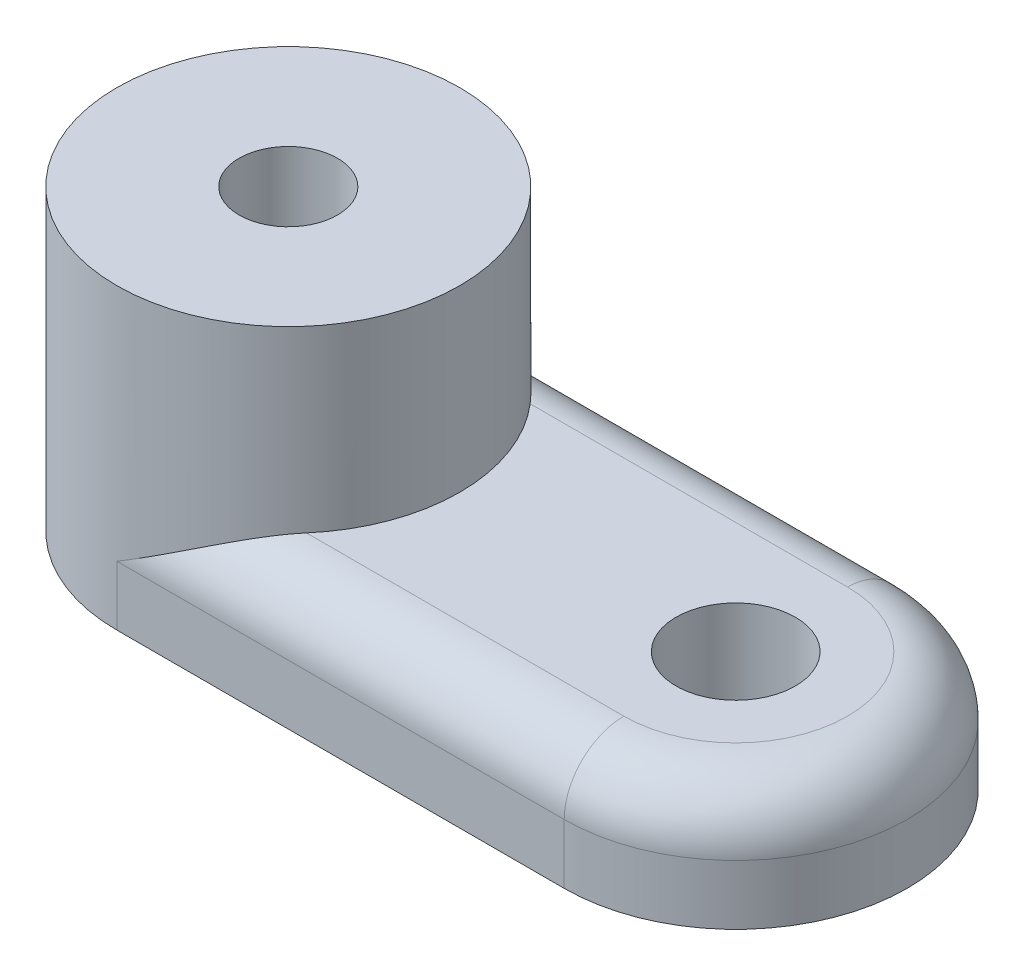
ISO-10303-21;
HEADER;
FILE_DESCRIPTION(('STEP AP214'),'2;1');
FILE_NAME('part.step','',(''),(''),'','','');
FILE_SCHEMA(('AUTOMOTIVE_DESIGN { 1 0 10303 214 1 1 1 1 }'));
ENDSEC;
DATA;
#1=APPLICATION_CONTEXT('core data for automotive mechanical design processes');
#2=APPLICATION_PROTOCOL_DEFINITION('international standard','automotive_design',2000,#1);
#3=PRODUCT_CONTEXT('',#1,'mechanical');
#4=PRODUCT('Part','Part','',(#3));
#5=PRODUCT_RELATED_PRODUCT_CATEGORY('part','',(#4));
#6=PRODUCT_DEFINITION_FORMATION('','',#4);
#7=PRODUCT_DEFINITION_CONTEXT('part definition',#1,'design');
#8=PRODUCT_DEFINITION('design','',#6,#7);
#9=PRODUCT_DEFINITION_SHAPE('','',#8);
#10=(LENGTH_UNIT() NAMED_UNIT(*) SI_UNIT(.MILLI.,.METRE.));
#11=(NAMED_UNIT(*) PLANE_ANGLE_UNIT() SI_UNIT($,.RADIAN.));
#12=(NAMED_UNIT(*) SI_UNIT($,.STERADIAN.) SOLID_ANGLE_UNIT());
#13=UNCERTAINTY_MEASURE_WITH_UNIT(LENGTH_MEASURE(1.E-05),#10,'distance_accuracy_value','');
#14=(GEOMETRIC_REPRESENTATION_CONTEXT(3) GLOBAL_UNCERTAINTY_ASSIGNED_CONTEXT((#13)) GLOBAL_UNIT_ASSIGNED_CONTEXT((#10,
#11,#12)) REPRESENTATION_CONTEXT('',''));
#15=CARTESIAN_POINT('',(0.,0.,0.));
#16=DIRECTION('',(0.,0.,1.));
#17=DIRECTION('',(1.,0.,0.));
#18=AXIS2_PLACEMENT_3D('',#15,#16,#17);
#19=CARTESIAN_POINT('',(0.,10.,0.));
#20=DIRECTION('',(0.,1.,0.));
#21=DIRECTION('',(0.,0.,1.));
#22=AXIS2_PLACEMENT_3D('',#19,#20,#21);
#23=PLANE('',#22);
#24=CARTESIAN_POINT('',(0.,10.,0.));
#25=DIRECTION('',(0.,1.,0.));
#26=DIRECTION('',(0.,0.,1.));
#27=AXIS2_PLACEMENT_3D('',#24,#25,#26);
#28=CIRCLE('',#27,5.75);
#29=CARTESIAN_POINT('',(0.,10.,5.75));
#30=VERTEX_POINT('',#29);
#31=EDGE_CURVE('E153',#30,#30,#28,.T.);
#32=ORIENTED_EDGE('',*,*,#31,.T.);
#33=EDGE_LOOP('',(#32));
#34=FACE_BOUND('',#33,.T.);
#35=CARTESIAN_POINT('',(0.,10.,0.));
#36=DIRECTION('',(0.,1.,0.));
#37=DIRECTION('',(0.,0.,1.));
#38=AXIS2_PLACEMENT_3D('',#35,#36,#37);
#39=CIRCLE('',#38,1.65);
#40=CARTESIAN_POINT('',(0.,10.,1.65));
#41=VERTEX_POINT('',#40);
#42=EDGE_CURVE('E146',#41,#41,#39,.T.);
#43=ORIENTED_EDGE('',*,*,#42,.F.);
#44=EDGE_LOOP('',(#43));
#45=FACE_BOUND('',#44,.T.);
#46=ADVANCED_FACE('F39',(#34,#45),#23,.T.);
#47=CARTESIAN_POINT('',(0.,0.,0.));
#48=DIRECTION('',(0.,1.,0.));
#49=DIRECTION('',(0.,0.,1.));
#50=AXIS2_PLACEMENT_3D('',#47,#48,#49);
#51=PLANE('',#50);
#52=CARTESIAN_POINT('',(0.,0.,0.));
#53=DIRECTION('',(0.,1.,0.));
#54=DIRECTION('',(0.,0.,1.));
#55=AXIS2_PLACEMENT_3D('',#52,#53,#54);
#56=CIRCLE('',#55,5.75);
#57=CARTESIAN_POINT('',(0.,0.,-5.75));
#58=VERTEX_POINT('',#57);
#59=CARTESIAN_POINT('',(0.,0.,5.75));
#60=VERTEX_POINT('',#59);
#61=EDGE_CURVE('E121',#58,#60,#56,.T.);
#62=ORIENTED_EDGE('',*,*,#61,.F.);
#63=DIRECTION('',(1.,0.,0.));
#64=VECTOR('',#63,1.);
#65=CARTESIAN_POINT('',(0.,0.,-5.75));
#66=LINE('',#65,#64);
#67=CARTESIAN_POINT('',(15.,0.,-5.75));
#68=VERTEX_POINT('',#67);
#69=EDGE_CURVE('E101',#58,#68,#66,.T.);
#70=ORIENTED_EDGE('',*,*,#69,.T.);
#71=CARTESIAN_POINT('',(15.,0.,0.));
#72=DIRECTION('',(0.,-1.,0.));
#73=DIRECTION('',(0.,0.,-1.));
#74=AXIS2_PLACEMENT_3D('',#71,#72,#73);
#75=CIRCLE('',#74,5.75);
#76=CARTESIAN_POINT('',(15.,0.,5.75));
#77=VERTEX_POINT('',#76);
#78=EDGE_CURVE('E109',#68,#77,#75,.T.);
#79=ORIENTED_EDGE('',*,*,#78,.T.);
#80=DIRECTION('',(-1.,0.,0.));
#81=VECTOR('',#80,1.);
#82=CARTESIAN_POINT('',(0.,0.,5.75));
#83=LINE('',#82,#81);
#84=EDGE_CURVE('E115',#77,#60,#83,.T.);
#85=ORIENTED_EDGE('',*,*,#84,.T.);
#86=EDGE_LOOP('',(#62,#70,#79,#85));
#87=FACE_BOUND('',#86,.T.);
#88=CARTESIAN_POINT('',(0.,0.,0.));
#89=DIRECTION('',(0.,1.,0.));
#90=DIRECTION('',(0.,0.,1.));
#91=AXIS2_PLACEMENT_3D('',#88,#89,#90);
#92=CIRCLE('',#91,1.65);
#93=CARTESIAN_POINT('',(0.,0.,1.65));
#94=VERTEX_POINT('',#93);
#95=EDGE_CURVE('E140',#94,#94,#92,.T.);
#96=ORIENTED_EDGE('',*,*,#95,.T.);
#97=EDGE_LOOP('',(#96));
#98=FACE_BOUND('',#97,.T.);
#99=CARTESIAN_POINT('',(15.,0.,0.));
#100=DIRECTION('',(0.,-1.,0.));
#101=DIRECTION('',(0.,0.,-1.));
#102=AXIS2_PLACEMENT_3D('',#99,#100,#101);
#103=CIRCLE('',#102,2.);
#104=CARTESIAN_POINT('',(15.,0.,-2.));
#105=VERTEX_POINT('',#104);
#106=EDGE_CURVE('E132',#105,#105,#103,.T.);
#107=ORIENTED_EDGE('',*,*,#106,.F.);
#108=EDGE_LOOP('',(#107));
#109=FACE_BOUND('',#108,.T.);
#110=ADVANCED_FACE('F118',(#87,#98,#109),#51,.F.);
#111=CARTESIAN_POINT('',(0.,10.,0.));
#112=DIRECTION('',(0.,-1.,0.));
#113=DIRECTION('',(0.,0.,-1.));
#114=AXIS2_PLACEMENT_3D('',#111,#112,#113);
#115=CYLINDRICAL_SURFACE('',#114,5.75);
#116=CARTESIAN_POINT('',(0.,4.,0.));
#117=DIRECTION('',(0.,-1.,0.));
#118=DIRECTION('',(0.,0.,-1.));
#119=AXIS2_PLACEMENT_3D('',#116,#117,#118);
#120=CIRCLE('',#119,5.75);
#121=CARTESIAN_POINT('',(4.35889894354067,4.,-3.75));
#122=VERTEX_POINT('',#121);
#123=CARTESIAN_POINT('',(4.35889894354067,4.,3.75));
#124=VERTEX_POINT('',#123);
#125=EDGE_CURVE('E136',#122,#124,#120,.T.);
#126=ORIENTED_EDGE('',*,*,#125,.F.);
#127=CARTESIAN_POINT('',(4.35889894354067,4.,-3.75));
#128=CARTESIAN_POINT('',(4.30342631143717,3.99999106755068,-3.81449013262664));
#129=CARTESIAN_POINT('',(4.24655969223738,3.99688268919264,-3.87768461242483));
#130=CARTESIAN_POINT('',(4.13043330135726,3.98513772264388,-4.00114705480012));
#131=CARTESIAN_POINT('',(4.07117690273136,3.97650868722017,-4.06141889480964));
#132=CARTESIAN_POINT('',(3.89115180869618,3.94350787994549,-4.23666241177958));
#133=CARTESIAN_POINT('',(3.7672248410097,3.91200024635705,-4.34710657854859));
#134=CARTESIAN_POINT('',(3.53875028019914,3.8420744619656,-4.53398426376112));
#135=CARTESIAN_POINT('',(3.43528162316207,3.80629725399042,-4.61280290846627));
#136=CARTESIAN_POINT('',(3.22520719720471,3.72710369244537,-4.76205115253324));
#137=CARTESIAN_POINT('',(3.11860025700197,3.68368445579775,-4.83247756891619));
#138=CARTESIAN_POINT('',(2.90236210167529,3.59043387365239,-4.96537999662964));
#139=CARTESIAN_POINT('',(2.79271729433083,3.54056798367339,-5.02780927962805));
#140=CARTESIAN_POINT('',(2.57147177565107,3.43581712513039,-5.14448031628806));
#141=CARTESIAN_POINT('',(2.45987052508158,3.38093075466699,-5.19871977177785));
#142=CARTESIAN_POINT('',(2.18779876376232,3.24317808805173,-5.32039903950877));
#143=CARTESIAN_POINT('',(2.02654103513665,3.15826295567872,-5.38377812257367));
#144=CARTESIAN_POINT('',(1.70182643101342,2.98262567649244,-5.49506722301522));
#145=CARTESIAN_POINT('',(1.5383685203808,2.89190071508586,-5.54296967370209));
#146=CARTESIAN_POINT('',(1.21040042797862,2.70672778588765,-5.62368915711501));
#147=CARTESIAN_POINT('',(1.04589364948137,2.61228913134788,-5.65654160213398));
#148=CARTESIAN_POINT('',(0.716094717395658,2.42107311297462,-5.70767403288487));
#149=CARTESIAN_POINT('',(0.55080296753006,2.32429686469381,-5.72596083344358));
#150=CARTESIAN_POINT('',(0.261304958342395,2.15410110211595,-5.74540393644368));
#151=CARTESIAN_POINT('',(0.137175275276702,2.08090128749655,-5.74970323811746));
#152=CARTESIAN_POINT('',(0.00870872759472776,2.00513612737229,-5.74999505236262));
#153=CARTESIAN_POINT('',(0.00435435050670675,2.00256805586337,-5.749999998415));
#154=CARTESIAN_POINT('',(0.,2.,-5.75));
#155=B_SPLINE_CURVE_WITH_KNOTS('',3,(#127,#128,#129,#130,#131,#132,#133,#134,#135,#136,#137,
#138,#139,#140,#141,#142,#143,#144,#145,#146,#147,#148,#149,#150,#151,#152,#153,#154),
.UNSPECIFIED.,.F.,.F.,(4,2,2,2,2,2,2,2,2,2,2,2,2,4),(0.,0.255001439017275,0.509654756443308,
1.01486135310594,1.4190645887283,1.82342064464555,2.23004097840383,2.63677520389152,
3.21480244868547,3.79311187097874,4.37005346660739,4.94672496980306,5.37899012908424,
5.39415588723173),.UNSPECIFIED.);
#156=CARTESIAN_POINT('',(0.,2.,-5.75));
#157=VERTEX_POINT('',#156);
#158=EDGE_CURVE('E50',#122,#157,#155,.T.);
#159=ORIENTED_EDGE('',*,*,#158,.T.);
#160=DIRECTION('',(0.,-1.,0.));
#161=VECTOR('',#160,1.);
#162=CARTESIAN_POINT('',(0.,4.,-5.75));
#163=LINE('',#162,#161);
#164=EDGE_CURVE('E137',#157,#58,#163,.T.);
#165=ORIENTED_EDGE('',*,*,#164,.T.);
#166=ORIENTED_EDGE('',*,*,#61,.T.);
#167=DIRECTION('',(0.,-1.,0.));
#168=VECTOR('',#167,1.);
#169=CARTESIAN_POINT('',(0.,4.,5.75));
#170=LINE('',#169,#168);
#171=CARTESIAN_POINT('',(0.,2.,5.75));
#172=VERTEX_POINT('',#171);
#173=EDGE_CURVE('E141',#172,#60,#170,.T.);
#174=ORIENTED_EDGE('',*,*,#173,.F.);
#175=CARTESIAN_POINT('',(4.35889894354067,4.,3.75));
#176=CARTESIAN_POINT('',(4.30342631143717,3.99999106755068,3.81449013262664));
#177=CARTESIAN_POINT('',(4.24655969223738,3.99688268919264,3.87768461242483));
#178=CARTESIAN_POINT('',(4.13043330135726,3.98513772264388,4.00114705480012));
#179=CARTESIAN_POINT('',(4.07117690273136,3.97650868722017,4.06141889480964));
#180=CARTESIAN_POINT('',(3.89115180869618,3.94350787994549,4.23666241177958));
#181=CARTESIAN_POINT('',(3.7672248410097,3.91200024635705,4.34710657854859));
#182=CARTESIAN_POINT('',(3.53875028019914,3.8420744619656,4.53398426376112));
#183=CARTESIAN_POINT('',(3.43528162316207,3.80629725399042,4.61280290846627));
#184=CARTESIAN_POINT('',(3.22520719720471,3.72710369244537,4.76205115253324));
#185=CARTESIAN_POINT('',(3.11860025700197,3.68368445579775,4.83247756891619));
#186=CARTESIAN_POINT('',(2.90236210167529,3.59043387365239,4.96537999662964));
#187=CARTESIAN_POINT('',(2.79271729433084,3.54056798367339,5.02780927962805));
#188=CARTESIAN_POINT('',(2.57147177565107,3.43581712513039,5.14448031628806));
#189=CARTESIAN_POINT('',(2.45987052508158,3.380930754667,5.19871977177785));
#190=CARTESIAN_POINT('',(2.18779876376232,3.24317808805174,5.32039903950877));
#191=CARTESIAN_POINT('',(2.02654103513665,3.15826295567872,5.38377812257367));
#192=CARTESIAN_POINT('',(1.70182643101342,2.98262567649244,5.49506722301522));
#193=CARTESIAN_POINT('',(1.5383685203808,2.89190071508586,5.54296967370209));
#194=CARTESIAN_POINT('',(1.21040042797863,2.70672778588765,5.62368915711501));
#195=CARTESIAN_POINT('',(1.04589364948137,2.61228913134787,5.65654160213398));
#196=CARTESIAN_POINT('',(0.716094717395656,2.42107311297462,5.70767403288487));
#197=CARTESIAN_POINT('',(0.550802967530052,2.32429686469382,5.72596083344358));
#198=CARTESIAN_POINT('',(0.261304958342405,2.15410110211593,5.74540393644368));
#199=CARTESIAN_POINT('',(0.137175275276729,2.0809012874965,5.74970323811746));
#200=CARTESIAN_POINT('',(0.00870872759472999,2.00513612737228,5.74999505236262));
#201=CARTESIAN_POINT('',(0.00435435050670806,2.00256805586337,5.749999998415));
#202=CARTESIAN_POINT('',(0.,2.,5.75));
#203=B_SPLINE_CURVE_WITH_KNOTS('',3,(#175,#176,#177,#178,#179,#180,#181,#182,#183,#184,#185,
#186,#187,#188,#189,#190,#191,#192,#193,#194,#195,#196,#197,#198,#199,#200,#201,#202),
.UNSPECIFIED.,.F.,.F.,(4,2,2,2,2,2,2,2,2,2,2,2,2,4),(0.,0.255001439017275,0.509654756443309,
1.01486135310594,1.4190645887283,1.82342064464555,2.23004097840382,2.63677520389152,
3.21480244868547,3.79311187097874,4.37005346660739,4.94672496980306,5.37899012908424,
5.39415588723173),.UNSPECIFIED.);
#204=EDGE_CURVE('E11',#172,#124,#203,.F.);
#205=ORIENTED_EDGE('',*,*,#204,.T.);
#206=EDGE_LOOP('',(#126,#159,#165,#166,#174,#205));
#207=FACE_BOUND('',#206,.T.);
#208=ORIENTED_EDGE('',*,*,#31,.F.);
#209=EDGE_LOOP('',(#208));
#210=FACE_BOUND('',#209,.T.);
#211=ADVANCED_FACE('F185',(#207,#210),#115,.T.);
#212=CARTESIAN_POINT('',(0.,10.,0.));
#213=DIRECTION('',(0.,-1.,0.));
#214=DIRECTION('',(0.,0.,-1.));
#215=AXIS2_PLACEMENT_3D('',#212,#213,#214);
#216=CYLINDRICAL_SURFACE('',#215,1.65);
#217=ORIENTED_EDGE('',*,*,#42,.T.);
#218=EDGE_LOOP('',(#217));
#219=FACE_BOUND('',#218,.T.);
#220=ORIENTED_EDGE('',*,*,#95,.F.);
#221=EDGE_LOOP('',(#220));
#222=FACE_BOUND('',#221,.T.);
#223=ADVANCED_FACE('F208',(#219,#222),#216,.F.);
#224=CARTESIAN_POINT('',(0.,4.,-5.75));
#225=DIRECTION('',(0.,0.,-1.));
#226=DIRECTION('',(-1.,0.,0.));
#227=AXIS2_PLACEMENT_3D('',#224,#225,#226);
#228=PLANE('',#227);
#229=ORIENTED_EDGE('',*,*,#164,.F.);
#230=DIRECTION('',(1.,0.,0.));
#231=VECTOR('',#230,1.);
#232=CARTESIAN_POINT('',(15.,2.,-5.75));
#233=LINE('',#232,#231);
#234=CARTESIAN_POINT('',(15.,2.,-5.75));
#235=VERTEX_POINT('',#234);
#236=EDGE_CURVE('E103',#157,#235,#233,.T.);
#237=ORIENTED_EDGE('',*,*,#236,.T.);
#238=DIRECTION('',(0.,-1.,0.));
#239=VECTOR('',#238,1.);
#240=CARTESIAN_POINT('',(15.,4.,-5.75));
#241=LINE('',#240,#239);
#242=EDGE_CURVE('E96',#235,#68,#241,.T.);
#243=ORIENTED_EDGE('',*,*,#242,.T.);
#244=ORIENTED_EDGE('',*,*,#69,.F.);
#245=EDGE_LOOP('',(#229,#237,#243,#244));
#246=FACE_BOUND('',#245,.T.);
#247=ADVANCED_FACE('F99',(#246),#228,.T.);
#248=CARTESIAN_POINT('',(0.,4.,5.75));
#249=DIRECTION('',(0.,0.,1.));
#250=DIRECTION('',(1.,0.,0.));
#251=AXIS2_PLACEMENT_3D('',#248,#249,#250);
#252=PLANE('',#251);
#253=DIRECTION('',(0.,-1.,0.));
#254=VECTOR('',#253,1.);
#255=CARTESIAN_POINT('',(15.,4.,5.75));
#256=LINE('',#255,#254);
#257=CARTESIAN_POINT('',(15.,2.,5.75));
#258=VERTEX_POINT('',#257);
#259=EDGE_CURVE('E105',#258,#77,#256,.T.);
#260=ORIENTED_EDGE('',*,*,#259,.F.);
#261=DIRECTION('',(-1.,0.,0.));
#262=VECTOR('',#261,1.);
#263=CARTESIAN_POINT('',(0.,2.,5.75));
#264=LINE('',#263,#262);
#265=EDGE_CURVE('E58',#258,#172,#264,.T.);
#266=ORIENTED_EDGE('',*,*,#265,.T.);
#267=ORIENTED_EDGE('',*,*,#173,.T.);
#268=ORIENTED_EDGE('',*,*,#84,.F.);
#269=EDGE_LOOP('',(#260,#266,#267,#268));
#270=FACE_BOUND('',#269,.T.);
#271=ADVANCED_FACE('F214',(#270),#252,.T.);
#272=CARTESIAN_POINT('',(15.,4.,0.));
#273=DIRECTION('',(0.,-1.,0.));
#274=DIRECTION('',(0.,0.,-1.));
#275=AXIS2_PLACEMENT_3D('',#272,#273,#274);
#276=CYLINDRICAL_SURFACE('',#275,5.75);
#277=ORIENTED_EDGE('',*,*,#242,.F.);
#278=CARTESIAN_POINT('',(15.,2.,0.));
#279=DIRECTION('',(0.,-1.,0.));
#280=DIRECTION('',(0.,0.,-1.));
#281=AXIS2_PLACEMENT_3D('',#278,#279,#280);
#282=CIRCLE('',#281,5.75);
#283=EDGE_CURVE('E66',#235,#258,#282,.T.);
#284=ORIENTED_EDGE('',*,*,#283,.T.);
#285=ORIENTED_EDGE('',*,*,#259,.T.);
#286=ORIENTED_EDGE('',*,*,#78,.F.);
#287=EDGE_LOOP('',(#277,#284,#285,#286));
#288=FACE_BOUND('',#287,.T.);
#289=ADVANCED_FACE('F110',(#288),#276,.T.);
#290=CARTESIAN_POINT('',(15.,4.,0.));
#291=DIRECTION('',(0.,-1.,0.));
#292=DIRECTION('',(0.,0.,-1.));
#293=AXIS2_PLACEMENT_3D('',#290,#291,#292);
#294=CYLINDRICAL_SURFACE('',#293,2.);
#295=CARTESIAN_POINT('',(15.,4.,0.));
#296=DIRECTION('',(0.,-1.,0.));
#297=DIRECTION('',(0.,0.,-1.));
#298=AXIS2_PLACEMENT_3D('',#295,#296,#297);
#299=CIRCLE('',#298,2.);
#300=CARTESIAN_POINT('',(15.,4.,-2.));
#301=VERTEX_POINT('',#300);
#302=EDGE_CURVE('E106',#301,#301,#299,.T.);
#303=ORIENTED_EDGE('',*,*,#302,.F.);
#304=EDGE_LOOP('',(#303));
#305=FACE_BOUND('',#304,.T.);
#306=ORIENTED_EDGE('',*,*,#106,.T.);
#307=EDGE_LOOP('',(#306));
#308=FACE_BOUND('',#307,.T.);
#309=ADVANCED_FACE('F217',(#305,#308),#294,.F.);
#310=CARTESIAN_POINT('',(0.,4.,0.));
#311=DIRECTION('',(0.,-1.,0.));
#312=DIRECTION('',(0.,0.,-1.));
#313=AXIS2_PLACEMENT_3D('',#310,#311,#312);
#314=PLANE('',#313);
#315=CARTESIAN_POINT('',(15.,4.,0.));
#316=DIRECTION('',(0.,-1.,0.));
#317=DIRECTION('',(0.,0.,-1.));
#318=AXIS2_PLACEMENT_3D('',#315,#316,#317);
#319=CIRCLE('',#318,3.75);
#320=CARTESIAN_POINT('',(15.,4.,3.75));
#321=VERTEX_POINT('',#320);
#322=CARTESIAN_POINT('',(15.,4.,-3.75));
#323=VERTEX_POINT('',#322);
#324=EDGE_CURVE('E164',#321,#323,#319,.F.);
#325=ORIENTED_EDGE('',*,*,#324,.T.);
#326=DIRECTION('',(1.,0.,0.));
#327=VECTOR('',#326,1.);
#328=CARTESIAN_POINT('',(0.,4.,-3.75));
#329=LINE('',#328,#327);
#330=EDGE_CURVE('E167',#323,#122,#329,.F.);
#331=ORIENTED_EDGE('',*,*,#330,.T.);
#332=ORIENTED_EDGE('',*,*,#125,.T.);
#333=DIRECTION('',(-1.,0.,0.));
#334=VECTOR('',#333,1.);
#335=CARTESIAN_POINT('',(15.,4.,3.75));
#336=LINE('',#335,#334);
#337=EDGE_CURVE('E161',#124,#321,#336,.F.);
#338=ORIENTED_EDGE('',*,*,#337,.T.);
#339=EDGE_LOOP('',(#325,#331,#332,#338));
#340=FACE_BOUND('',#339,.T.);
#341=ORIENTED_EDGE('',*,*,#302,.T.);
#342=EDGE_LOOP('',(#341));
#343=FACE_BOUND('',#342,.T.);
#344=ADVANCED_FACE('F198',(#340,#343),#314,.F.);
#345=CARTESIAN_POINT('',(0.,2.,3.75));
#346=DIRECTION('',(1.,0.,0.));
#347=DIRECTION('',(0.,0.,-1.));
#348=AXIS2_PLACEMENT_3D('',#345,#346,#347);
#349=CYLINDRICAL_SURFACE('',#348,2.);
#350=ORIENTED_EDGE('',*,*,#204,.F.);
#351=ORIENTED_EDGE('',*,*,#265,.F.);
#352=CARTESIAN_POINT('',(15.,2.,3.75));
#353=DIRECTION('',(1.,0.,0.));
#354=DIRECTION('',(0.,0.,-1.));
#355=AXIS2_PLACEMENT_3D('',#352,#353,#354);
#356=CIRCLE('',#355,2.);
#357=EDGE_CURVE('E44',#321,#258,#356,.T.);
#358=ORIENTED_EDGE('',*,*,#357,.F.);
#359=ORIENTED_EDGE('',*,*,#337,.F.);
#360=EDGE_LOOP('',(#350,#351,#358,#359));
#361=FACE_BOUND('',#360,.T.);
#362=ADVANCED_FACE('F41',(#361),#349,.T.);
#363=CARTESIAN_POINT('',(15.,2.,0.));
#364=DIRECTION('',(0.,-1.,0.));
#365=DIRECTION('',(0.,0.,-1.));
#366=AXIS2_PLACEMENT_3D('',#363,#364,#365);
#367=TOROIDAL_SURFACE('',#366,3.75,2.);
#368=ORIENTED_EDGE('',*,*,#357,.T.);
#369=ORIENTED_EDGE('',*,*,#283,.F.);
#370=CARTESIAN_POINT('',(15.,2.,-3.75));
#371=DIRECTION('',(-1.,0.,0.));
#372=DIRECTION('',(0.,0.,1.));
#373=AXIS2_PLACEMENT_3D('',#370,#371,#372);
#374=CIRCLE('',#373,2.);
#375=EDGE_CURVE('E126',#323,#235,#374,.T.);
#376=ORIENTED_EDGE('',*,*,#375,.F.);
#377=ORIENTED_EDGE('',*,*,#324,.F.);
#378=EDGE_LOOP('',(#368,#369,#376,#377));
#379=FACE_BOUND('',#378,.T.);
#380=ADVANCED_FACE('F191',(#379),#367,.T.);
#381=CARTESIAN_POINT('',(0.,2.,-3.75));
#382=DIRECTION('',(-1.,0.,0.));
#383=DIRECTION('',(0.,0.,1.));
#384=AXIS2_PLACEMENT_3D('',#381,#382,#383);
#385=CYLINDRICAL_SURFACE('',#384,2.);
#386=ORIENTED_EDGE('',*,*,#158,.F.);
#387=ORIENTED_EDGE('',*,*,#330,.F.);
#388=ORIENTED_EDGE('',*,*,#375,.T.);
#389=ORIENTED_EDGE('',*,*,#236,.F.);
#390=EDGE_LOOP('',(#386,#387,#388,#389));
#391=FACE_BOUND('',#390,.T.);
#392=ADVANCED_FACE('F188',(#391),#385,.T.);
#393=CLOSED_SHELL('',(#46,#110,#211,#223,#247,#271,#289,#309,#344,#362,#380,#392));
#394=MANIFOLD_SOLID_BREP('B2',#393);
#395=ADVANCED_BREP_SHAPE_REPRESENTATION('',(#18,#394),#14);
#396=SHAPE_DEFINITION_REPRESENTATION(#9,#395);
ENDSEC;
END-ISO-10303-21;
